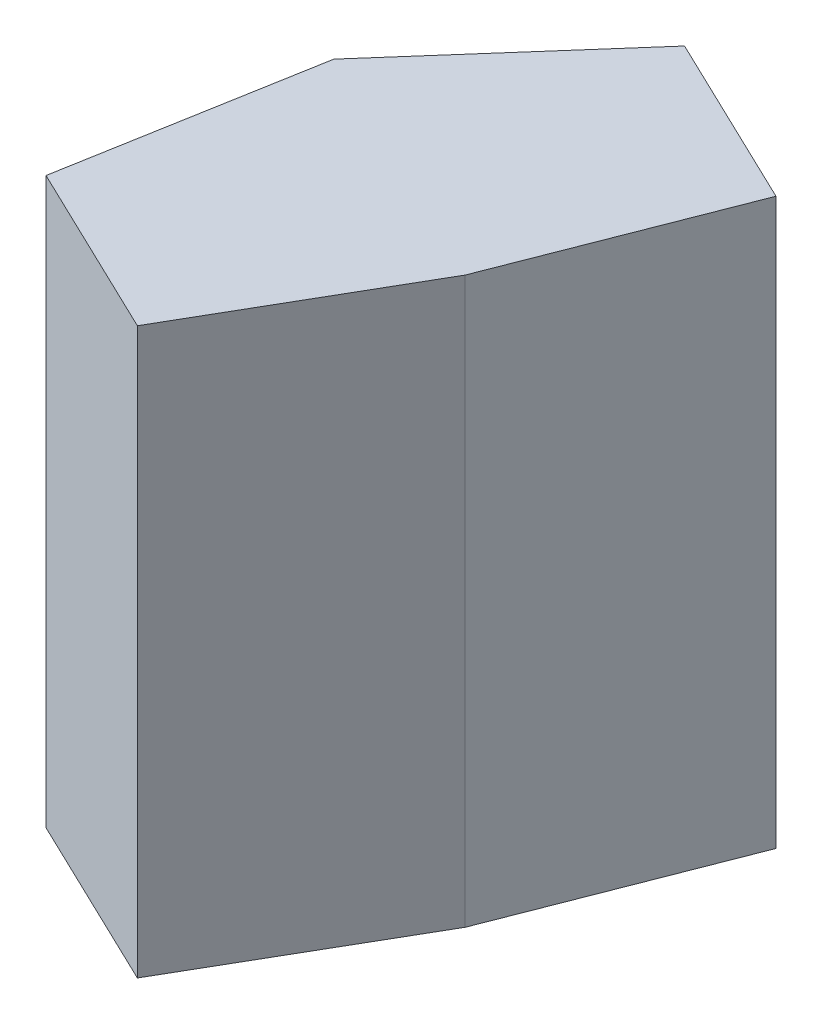
ISO-10303-21;
HEADER;
FILE_DESCRIPTION(('STEP AP214'),'2;1');
FILE_NAME('part.step','',(''),(''),'','','');
FILE_SCHEMA(('AUTOMOTIVE_DESIGN { 1 0 10303 214 1 1 1 1 }'));
ENDSEC;
DATA;
#1=APPLICATION_CONTEXT('core data for automotive mechanical design processes');
#2=APPLICATION_PROTOCOL_DEFINITION('international standard','automotive_design',2000,#1);
#3=PRODUCT_CONTEXT('',#1,'mechanical');
#4=PRODUCT('Part','Part','',(#3));
#5=PRODUCT_RELATED_PRODUCT_CATEGORY('part','',(#4));
#6=PRODUCT_DEFINITION_FORMATION('','',#4);
#7=PRODUCT_DEFINITION_CONTEXT('part definition',#1,'design');
#8=PRODUCT_DEFINITION('design','',#6,#7);
#9=PRODUCT_DEFINITION_SHAPE('','',#8);
#10=(LENGTH_UNIT() NAMED_UNIT(*) SI_UNIT(.MILLI.,.METRE.));
#11=(NAMED_UNIT(*) PLANE_ANGLE_UNIT() SI_UNIT($,.RADIAN.));
#12=(NAMED_UNIT(*) SI_UNIT($,.STERADIAN.) SOLID_ANGLE_UNIT());
#13=UNCERTAINTY_MEASURE_WITH_UNIT(LENGTH_MEASURE(1.E-05),#10,'distance_accuracy_value','');
#14=(GEOMETRIC_REPRESENTATION_CONTEXT(3) GLOBAL_UNCERTAINTY_ASSIGNED_CONTEXT((#13)) GLOBAL_UNIT_ASSIGNED_CONTEXT((#10,
#11,#12)) REPRESENTATION_CONTEXT('',''));
#15=CARTESIAN_POINT('',(0.,0.,0.));
#16=DIRECTION('',(0.,0.,1.));
#17=DIRECTION('',(1.,0.,0.));
#18=AXIS2_PLACEMENT_3D('',#15,#16,#17);
#19=CARTESIAN_POINT('',(6.31817285672578,6.5,-10.9433963988516));
#20=DIRECTION('',(-0.866025403784439,0.,-0.5));
#21=DIRECTION('',(-0.5,0.,0.866025403784439));
#22=AXIS2_PLACEMENT_3D('',#19,#20,#21);
#23=PLANE('',#22);
#24=DIRECTION('',(0.5,0.,-0.866025403784439));
#25=VECTOR('',#24,1.);
#26=CARTESIAN_POINT('',(6.31817285672578,-6.5,-10.9433963988516));
#27=LINE('',#26,#25);
#28=CARTESIAN_POINT('',(6.31817285672578,-6.5,-10.9433963988516));
#29=VERTEX_POINT('',#28);
#30=CARTESIAN_POINT('',(9.07990030136609,-6.5,-15.726848649626));
#31=VERTEX_POINT('',#30);
#32=EDGE_CURVE('E134',#29,#31,#27,.T.);
#33=ORIENTED_EDGE('',*,*,#32,.T.);
#34=DIRECTION('',(0.,-1.,0.));
#35=VECTOR('',#34,1.);
#36=CARTESIAN_POINT('',(9.07990030136609,6.5,-15.726848649626));
#37=LINE('',#36,#35);
#38=CARTESIAN_POINT('',(9.07990030136609,6.5,-15.726848649626));
#39=VERTEX_POINT('',#38);
#40=EDGE_CURVE('E131',#39,#31,#37,.T.);
#41=ORIENTED_EDGE('',*,*,#40,.F.);
#42=DIRECTION('',(0.5,0.,-0.866025403784439));
#43=VECTOR('',#42,1.);
#44=CARTESIAN_POINT('',(6.31817285672578,6.5,-10.9433963988516));
#45=LINE('',#44,#43);
#46=CARTESIAN_POINT('',(6.31817285672578,6.5,-10.9433963988516));
#47=VERTEX_POINT('',#46);
#48=EDGE_CURVE('E79',#47,#39,#45,.T.);
#49=ORIENTED_EDGE('',*,*,#48,.F.);
#50=DIRECTION('',(0.,-1.,0.));
#51=VECTOR('',#50,1.);
#52=CARTESIAN_POINT('',(6.31817285672578,6.5,-10.9433963988516));
#53=LINE('',#52,#51);
#54=EDGE_CURVE('E47',#47,#29,#53,.T.);
#55=ORIENTED_EDGE('',*,*,#54,.T.);
#56=EDGE_LOOP('',(#33,#41,#49,#55));
#57=FACE_BOUND('',#56,.T.);
#58=ADVANCED_FACE('F39',(#57),#23,.F.);
#59=CARTESIAN_POINT('',(3.26526789961103,6.5,-18.5182544752442));
#60=DIRECTION('',(0.984807753012206,0.,0.17364817766694));
#61=DIRECTION('',(0.17364817766694,0.,-0.984807753012206));
#62=AXIS2_PLACEMENT_3D('',#59,#60,#61);
#63=PLANE('',#62);
#64=DIRECTION('',(-0.17364817766694,0.,0.984807753012206));
#65=VECTOR('',#64,1.);
#66=CARTESIAN_POINT('',(3.26526789961103,-6.5,-18.5182544752442));
#67=LINE('',#66,#65);
#68=CARTESIAN_POINT('',(3.26526789961103,-6.5,-18.5182544752442));
#69=VERTEX_POINT('',#68);
#70=CARTESIAN_POINT('',(2.27222589262074,-6.5,-12.8864333948838));
#71=VERTEX_POINT('',#70);
#72=EDGE_CURVE('E69',#69,#71,#67,.T.);
#73=ORIENTED_EDGE('',*,*,#72,.T.);
#74=DIRECTION('',(0.,-1.,0.));
#75=VECTOR('',#74,1.);
#76=CARTESIAN_POINT('',(2.27222589262074,6.5,-12.8864333948838));
#77=LINE('',#76,#75);
#78=CARTESIAN_POINT('',(2.27222589262074,6.5,-12.8864333948838));
#79=VERTEX_POINT('',#78);
#80=EDGE_CURVE('E11',#79,#71,#77,.T.);
#81=ORIENTED_EDGE('',*,*,#80,.F.);
#82=DIRECTION('',(-0.17364817766694,0.,0.984807753012206));
#83=VECTOR('',#82,1.);
#84=CARTESIAN_POINT('',(3.26526789961103,6.5,-18.5182544752442));
#85=LINE('',#84,#83);
#86=CARTESIAN_POINT('',(3.26526789961103,6.5,-18.5182544752442));
#87=VERTEX_POINT('',#86);
#88=EDGE_CURVE('E136',#87,#79,#85,.T.);
#89=ORIENTED_EDGE('',*,*,#88,.F.);
#90=DIRECTION('',(0.,-1.,0.));
#91=VECTOR('',#90,1.);
#92=CARTESIAN_POINT('',(3.26526789961102,6.5,-18.5182544752442));
#93=LINE('',#92,#91);
#94=EDGE_CURVE('E117',#87,#69,#93,.T.);
#95=ORIENTED_EDGE('',*,*,#94,.T.);
#96=EDGE_LOOP('',(#73,#81,#89,#95));
#97=FACE_BOUND('',#96,.T.);
#98=ADVANCED_FACE('F159',(#97),#63,.F.);
#99=CARTESIAN_POINT('',(2.27222589262074,6.5,-12.8864333948838));
#100=DIRECTION('',(0.432908961262466,0.,-0.901437646905571));
#101=DIRECTION('',(-0.901437646905571,0.,-0.432908961262466));
#102=AXIS2_PLACEMENT_3D('',#99,#100,#101);
#103=PLANE('',#102);
#104=DIRECTION('',(0.901437646905571,0.,0.432908961262466));
#105=VECTOR('',#104,1.);
#106=CARTESIAN_POINT('',(2.27222589262074,-6.5,-12.8864333948838));
#107=LINE('',#106,#105);
#108=EDGE_CURVE('E74',#71,#29,#107,.T.);
#109=ORIENTED_EDGE('',*,*,#108,.T.);
#110=ORIENTED_EDGE('',*,*,#54,.F.);
#111=DIRECTION('',(0.901437646905571,0.,0.432908961262466));
#112=VECTOR('',#111,1.);
#113=CARTESIAN_POINT('',(2.27222589262074,6.5,-12.8864333948838));
#114=LINE('',#113,#112);
#115=EDGE_CURVE('E55',#79,#47,#114,.T.);
#116=ORIENTED_EDGE('',*,*,#115,.F.);
#117=ORIENTED_EDGE('',*,*,#80,.T.);
#118=EDGE_LOOP('',(#109,#110,#116,#117));
#119=FACE_BOUND('',#118,.T.);
#120=ADVANCED_FACE('F164',(#119),#103,.F.);
#121=CARTESIAN_POINT('',(0.,6.5,0.));
#122=DIRECTION('',(0.,-1.,0.));
#123=DIRECTION('',(0.,0.,-1.));
#124=AXIS2_PLACEMENT_3D('',#121,#122,#123);
#125=PLANE('',#124);
#126=ORIENTED_EDGE('',*,*,#48,.T.);
#127=DIRECTION('',(-0.36305827513864,0.,0.931766434710628));
#128=VECTOR('',#127,1.);
#129=CARTESIAN_POINT('',(11.0852363062744,6.5,-20.873418519096));
#130=LINE('',#129,#128);
#131=CARTESIAN_POINT('',(11.0852363062744,6.5,-20.873418519096));
#132=VERTEX_POINT('',#131);
#133=EDGE_CURVE('E104',#132,#39,#130,.T.);
#134=ORIENTED_EDGE('',*,*,#133,.F.);
#135=DIRECTION('',(0.90156220424488,0.,0.432649502342386));
#136=VECTOR('',#135,1.);
#137=CARTESIAN_POINT('',(7.0387302880955,6.5,-22.8152909786419));
#138=LINE('',#137,#136);
#139=CARTESIAN_POINT('',(7.0387302880955,6.5,-22.8152909786419));
#140=VERTEX_POINT('',#139);
#141=EDGE_CURVE('E97',#140,#132,#138,.T.);
#142=ORIENTED_EDGE('',*,*,#141,.F.);
#143=DIRECTION('',(0.659846071608808,0.,-0.751400799695092));
#144=VECTOR('',#143,1.);
#145=CARTESIAN_POINT('',(3.26526789961102,6.5,-18.5182544752442));
#146=LINE('',#145,#144);
#147=EDGE_CURVE('E101',#87,#140,#146,.T.);
#148=ORIENTED_EDGE('',*,*,#147,.F.);
#149=ORIENTED_EDGE('',*,*,#88,.T.);
#150=ORIENTED_EDGE('',*,*,#115,.T.);
#151=EDGE_LOOP('',(#126,#134,#142,#148,#149,#150));
#152=FACE_BOUND('',#151,.T.);
#153=ADVANCED_FACE('F99',(#152),#125,.F.);
#154=CARTESIAN_POINT('',(0.,-6.5,0.));
#155=DIRECTION('',(0.,-1.,0.));
#156=DIRECTION('',(0.,0.,-1.));
#157=AXIS2_PLACEMENT_3D('',#154,#155,#156);
#158=PLANE('',#157);
#159=ORIENTED_EDGE('',*,*,#32,.F.);
#160=ORIENTED_EDGE('',*,*,#108,.F.);
#161=ORIENTED_EDGE('',*,*,#72,.F.);
#162=DIRECTION('',(0.659846071608808,0.,-0.751400799695092));
#163=VECTOR('',#162,1.);
#164=CARTESIAN_POINT('',(3.26526789961102,-6.5,-18.5182544752442));
#165=LINE('',#164,#163);
#166=CARTESIAN_POINT('',(7.0387302880955,-6.5,-22.8152909786419));
#167=VERTEX_POINT('',#166);
#168=EDGE_CURVE('E126',#69,#167,#165,.T.);
#169=ORIENTED_EDGE('',*,*,#168,.T.);
#170=DIRECTION('',(0.90156220424488,0.,0.432649502342386));
#171=VECTOR('',#170,1.);
#172=CARTESIAN_POINT('',(7.0387302880955,-6.5,-22.8152909786419));
#173=LINE('',#172,#171);
#174=CARTESIAN_POINT('',(11.0852363062744,-6.5,-20.873418519096));
#175=VERTEX_POINT('',#174);
#176=EDGE_CURVE('E113',#167,#175,#173,.T.);
#177=ORIENTED_EDGE('',*,*,#176,.T.);
#178=DIRECTION('',(-0.36305827513864,0.,0.931766434710628));
#179=VECTOR('',#178,1.);
#180=CARTESIAN_POINT('',(11.0852363062744,-6.5,-20.873418519096));
#181=LINE('',#180,#179);
#182=EDGE_CURVE('E123',#175,#31,#181,.T.);
#183=ORIENTED_EDGE('',*,*,#182,.T.);
#184=EDGE_LOOP('',(#159,#160,#161,#169,#177,#183));
#185=FACE_BOUND('',#184,.T.);
#186=ADVANCED_FACE('F144',(#185),#158,.T.);
#187=CARTESIAN_POINT('',(11.0852363062744,6.5,-20.873418519096));
#188=DIRECTION('',(-0.931766434710629,0.,-0.36305827513864));
#189=DIRECTION('',(0.36305827513864,0.,-0.931766434710628));
#190=AXIS2_PLACEMENT_3D('',#187,#188,#189);
#191=PLANE('',#190);
#192=ORIENTED_EDGE('',*,*,#182,.F.);
#193=DIRECTION('',(0.,-1.,0.));
#194=VECTOR('',#193,1.);
#195=CARTESIAN_POINT('',(11.0852363062744,6.5,-20.873418519096));
#196=LINE('',#195,#194);
#197=EDGE_CURVE('E108',#132,#175,#196,.T.);
#198=ORIENTED_EDGE('',*,*,#197,.F.);
#199=ORIENTED_EDGE('',*,*,#133,.T.);
#200=ORIENTED_EDGE('',*,*,#40,.T.);
#201=EDGE_LOOP('',(#192,#198,#199,#200));
#202=FACE_BOUND('',#201,.T.);
#203=ADVANCED_FACE('F147',(#202),#191,.F.);
#204=CARTESIAN_POINT('',(3.26526789961102,6.5,-18.5182544752442));
#205=DIRECTION('',(0.751400799695092,0.,0.659846071608808));
#206=DIRECTION('',(-0.659846071608808,0.,0.751400799695092));
#207=AXIS2_PLACEMENT_3D('',#204,#205,#206);
#208=PLANE('',#207);
#209=ORIENTED_EDGE('',*,*,#168,.F.);
#210=ORIENTED_EDGE('',*,*,#94,.F.);
#211=ORIENTED_EDGE('',*,*,#147,.T.);
#212=DIRECTION('',(0.,-1.,0.));
#213=VECTOR('',#212,1.);
#214=CARTESIAN_POINT('',(7.0387302880955,6.5,-22.8152909786419));
#215=LINE('',#214,#213);
#216=EDGE_CURVE('E111',#140,#167,#215,.T.);
#217=ORIENTED_EDGE('',*,*,#216,.T.);
#218=EDGE_LOOP('',(#209,#210,#211,#217));
#219=FACE_BOUND('',#218,.T.);
#220=ADVANCED_FACE('F119',(#219),#208,.F.);
#221=CARTESIAN_POINT('',(7.0387302880955,6.5,-22.8152909786419));
#222=DIRECTION('',(-0.432649502342386,0.,0.90156220424488));
#223=DIRECTION('',(-0.90156220424488,0.,-0.432649502342386));
#224=AXIS2_PLACEMENT_3D('',#221,#222,#223);
#225=PLANE('',#224);
#226=ORIENTED_EDGE('',*,*,#176,.F.);
#227=ORIENTED_EDGE('',*,*,#216,.F.);
#228=ORIENTED_EDGE('',*,*,#141,.T.);
#229=ORIENTED_EDGE('',*,*,#197,.T.);
#230=EDGE_LOOP('',(#226,#227,#228,#229));
#231=FACE_BOUND('',#230,.T.);
#232=ADVANCED_FACE('F112',(#231),#225,.F.);
#233=CLOSED_SHELL('',(#58,#98,#120,#153,#186,#203,#220,#232));
#234=MANIFOLD_SOLID_BREP('B2',#233);
#235=ADVANCED_BREP_SHAPE_REPRESENTATION('',(#18,#234),#14);
#236=SHAPE_DEFINITION_REPRESENTATION(#9,#235);
ENDSEC;
END-ISO-10303-21;
